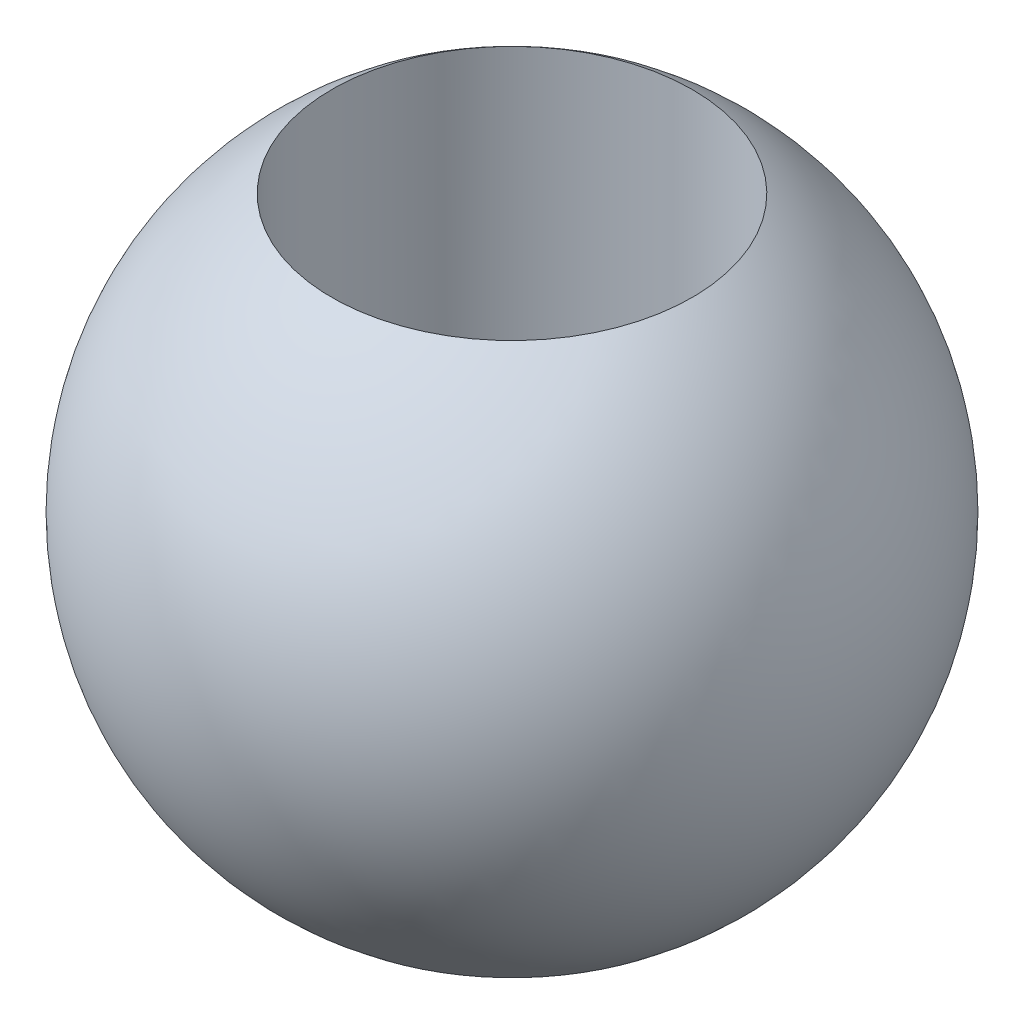
ISO-10303-21;
HEADER;
FILE_DESCRIPTION(('STEP AP214'),'2;1');
FILE_NAME('part.step','',(''),(''),'','','');
FILE_SCHEMA(('AUTOMOTIVE_DESIGN { 1 0 10303 214 1 1 1 1 }'));
ENDSEC;
DATA;
#1=APPLICATION_CONTEXT('core data for automotive mechanical design processes');
#2=APPLICATION_PROTOCOL_DEFINITION('international standard','automotive_design',2000,#1);
#3=PRODUCT_CONTEXT('',#1,'mechanical');
#4=PRODUCT('Part','Part','',(#3));
#5=PRODUCT_RELATED_PRODUCT_CATEGORY('part','',(#4));
#6=PRODUCT_DEFINITION_FORMATION('','',#4);
#7=PRODUCT_DEFINITION_CONTEXT('part definition',#1,'design');
#8=PRODUCT_DEFINITION('design','',#6,#7);
#9=PRODUCT_DEFINITION_SHAPE('','',#8);
#10=(LENGTH_UNIT() NAMED_UNIT(*) SI_UNIT(.MILLI.,.METRE.));
#11=(NAMED_UNIT(*) PLANE_ANGLE_UNIT() SI_UNIT($,.RADIAN.));
#12=(NAMED_UNIT(*) SI_UNIT($,.STERADIAN.) SOLID_ANGLE_UNIT());
#13=UNCERTAINTY_MEASURE_WITH_UNIT(LENGTH_MEASURE(1.E-05),#10,'distance_accuracy_value','');
#14=(GEOMETRIC_REPRESENTATION_CONTEXT(3) GLOBAL_UNCERTAINTY_ASSIGNED_CONTEXT((#13)) GLOBAL_UNIT_ASSIGNED_CONTEXT((#10,
#11,#12)) REPRESENTATION_CONTEXT('',''));
#15=CARTESIAN_POINT('',(0.,0.,0.));
#16=DIRECTION('',(0.,0.,1.));
#17=DIRECTION('',(1.,0.,0.));
#18=AXIS2_PLACEMENT_3D('',#15,#16,#17);
#19=CARTESIAN_POINT('',(0.,0.,0.));
#20=DIRECTION('',(-1.,0.,0.));
#21=DIRECTION('',(0.,1.,0.));
#22=AXIS2_PLACEMENT_3D('',#19,#20,#21);
#23=SPHERICAL_SURFACE('',#22,3.2);
#24=CARTESIAN_POINT('',(0.,0.,0.));
#25=DIRECTION('',(0.,-1.,0.));
#26=DIRECTION('',(0.,0.,-1.));
#27=AXIS2_PLACEMENT_3D('',#24,#25,#26);
#28=SPHERICAL_SURFACE('',#27,3.2);
#29=CARTESIAN_POINT('',(0.,2.67908566492376,0.));
#30=DIRECTION('',(0.,-1.,0.));
#31=DIRECTION('',(0.,0.,-1.));
#32=AXIS2_PLACEMENT_3D('',#29,#30,#31);
#33=CIRCLE('',#32,1.75);
#34=CARTESIAN_POINT('',(0.,2.67908566492376,-1.75));
#35=VERTEX_POINT('',#34);
#36=EDGE_CURVE('E10',#35,#35,#33,.T.);
#37=ORIENTED_EDGE('',*,*,#36,.T.);
#38=EDGE_LOOP('',(#37));
#39=FACE_BOUND('',#38,.T.);
#40=CARTESIAN_POINT('',(0.,-2.67908566492376,0.));
#41=DIRECTION('',(0.,1.,0.));
#42=DIRECTION('',(0.,0.,1.));
#43=AXIS2_PLACEMENT_3D('',#40,#41,#42);
#44=CIRCLE('',#43,1.75);
#45=CARTESIAN_POINT('',(0.,-2.67908566492376,1.75));
#46=VERTEX_POINT('',#45);
#47=EDGE_CURVE('E43',#46,#46,#44,.T.);
#48=ORIENTED_EDGE('',*,*,#47,.T.);
#49=EDGE_LOOP('',(#48));
#50=FACE_BOUND('',#49,.T.);
#51=ADVANCED_FACE('F37',(#39,#50),#28,.T.);
#52=CARTESIAN_POINT('',(0.,-3.2,0.));
#53=DIRECTION('',(0.,1.,0.));
#54=DIRECTION('',(0.,0.,1.));
#55=AXIS2_PLACEMENT_3D('',#52,#53,#54);
#56=CYLINDRICAL_SURFACE('',#55,1.75);
#57=ORIENTED_EDGE('',*,*,#47,.F.);
#58=EDGE_LOOP('',(#57));
#59=FACE_BOUND('',#58,.T.);
#60=ORIENTED_EDGE('',*,*,#36,.F.);
#61=EDGE_LOOP('',(#60));
#62=FACE_BOUND('',#61,.T.);
#63=ADVANCED_FACE('F50',(#59,#62),#56,.F.);
#64=CLOSED_SHELL('',(#51,#63));
#65=MANIFOLD_SOLID_BREP('B2',#64);
#66=ADVANCED_BREP_SHAPE_REPRESENTATION('',(#18,#65),#14);
#67=SHAPE_DEFINITION_REPRESENTATION(#9,#66);
ENDSEC;
END-ISO-10303-21;
